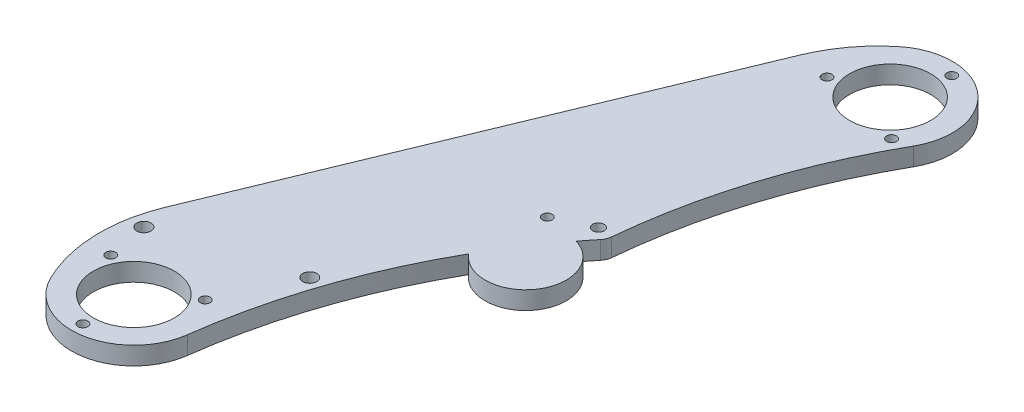
ISO-10303-21;
HEADER;
FILE_DESCRIPTION(('STEP AP214'),'2;1');
FILE_NAME('part.step','',(''),(''),'','','');
FILE_SCHEMA(('AUTOMOTIVE_DESIGN { 1 0 10303 214 1 1 1 1 }'));
ENDSEC;
DATA;
#1=APPLICATION_CONTEXT('core data for automotive mechanical design processes');
#2=APPLICATION_PROTOCOL_DEFINITION('international standard','automotive_design',2000,#1);
#3=PRODUCT_CONTEXT('',#1,'mechanical');
#4=PRODUCT('Part','Part','',(#3));
#5=PRODUCT_RELATED_PRODUCT_CATEGORY('part','',(#4));
#6=PRODUCT_DEFINITION_FORMATION('','',#4);
#7=PRODUCT_DEFINITION_CONTEXT('part definition',#1,'design');
#8=PRODUCT_DEFINITION('design','',#6,#7);
#9=PRODUCT_DEFINITION_SHAPE('','',#8);
#10=(LENGTH_UNIT() NAMED_UNIT(*) SI_UNIT(.MILLI.,.METRE.));
#11=(NAMED_UNIT(*) PLANE_ANGLE_UNIT() SI_UNIT($,.RADIAN.));
#12=(NAMED_UNIT(*) SI_UNIT($,.STERADIAN.) SOLID_ANGLE_UNIT());
#13=UNCERTAINTY_MEASURE_WITH_UNIT(LENGTH_MEASURE(1.E-05),#10,'distance_accuracy_value','');
#14=(GEOMETRIC_REPRESENTATION_CONTEXT(3) GLOBAL_UNCERTAINTY_ASSIGNED_CONTEXT((#13)) GLOBAL_UNIT_ASSIGNED_CONTEXT((#10,
#11,#12)) REPRESENTATION_CONTEXT('',''));
#15=CARTESIAN_POINT('',(0.,0.,0.));
#16=DIRECTION('',(0.,0.,1.));
#17=DIRECTION('',(1.,0.,0.));
#18=AXIS2_PLACEMENT_3D('',#15,#16,#17);
#19=CARTESIAN_POINT('',(-65.5552213636736,6.35,-46.4255332852399));
#20=DIRECTION('',(0.,-1.,0.));
#21=DIRECTION('',(0.,0.,-1.));
#22=AXIS2_PLACEMENT_3D('',#19,#20,#21);
#23=CYLINDRICAL_SURFACE('',#22,5.1943);
#24=CARTESIAN_POINT('',(-65.5552213636736,0.,-46.4255332852399));
#25=DIRECTION('',(0.,1.,0.));
#26=DIRECTION('',(0.,0.,1.));
#27=AXIS2_PLACEMENT_3D('',#24,#25,#26);
#28=CIRCLE('',#27,5.1943);
#29=CARTESIAN_POINT('',(-61.5228035545966,0.,-43.1513373376769));
#30=VERTEX_POINT('',#29);
#31=CARTESIAN_POINT('',(-60.3842207954488,0.,-45.93410107891));
#32=VERTEX_POINT('',#31);
#33=EDGE_CURVE('E155',#30,#32,#28,.T.);
#34=ORIENTED_EDGE('',*,*,#33,.T.);
#35=DIRECTION('',(0.,-1.,0.));
#36=VECTOR('',#35,1.);
#37=CARTESIAN_POINT('',(-60.3842207954488,6.35,-45.93410107891));
#38=LINE('',#37,#36);
#39=CARTESIAN_POINT('',(-60.3842207954488,6.35,-45.93410107891));
#40=VERTEX_POINT('',#39);
#41=EDGE_CURVE('E11',#40,#32,#38,.T.);
#42=ORIENTED_EDGE('',*,*,#41,.F.);
#43=CARTESIAN_POINT('',(-65.5552213636736,6.35,-46.4255332852399));
#44=DIRECTION('',(0.,1.,0.));
#45=DIRECTION('',(0.,0.,1.));
#46=AXIS2_PLACEMENT_3D('',#43,#44,#45);
#47=CIRCLE('',#46,5.1943);
#48=CARTESIAN_POINT('',(-61.5228035545966,6.35,-43.1513373376769));
#49=VERTEX_POINT('',#48);
#50=EDGE_CURVE('E232',#49,#40,#47,.T.);
#51=ORIENTED_EDGE('',*,*,#50,.F.);
#52=DIRECTION('',(0.,-1.,0.));
#53=VECTOR('',#52,1.);
#54=CARTESIAN_POINT('',(-61.5228035545966,6.35,-43.1513373376769));
#55=LINE('',#54,#53);
#56=EDGE_CURVE('E151',#49,#30,#55,.T.);
#57=ORIENTED_EDGE('',*,*,#56,.T.);
#58=EDGE_LOOP('',(#34,#42,#51,#57));
#59=FACE_BOUND('',#58,.T.);
#60=ADVANCED_FACE('F37',(#59),#23,.T.);
#61=CARTESIAN_POINT('',(141.904309990853,6.35,-26.7093692909436));
#62=DIRECTION('',(0.,-1.,0.));
#63=DIRECTION('',(0.,0.,-1.));
#64=AXIS2_PLACEMENT_3D('',#61,#62,#63);
#65=CYLINDRICAL_SURFACE('',#64,203.2);
#66=CARTESIAN_POINT('',(141.904309990853,0.,-26.7093692909436));
#67=DIRECTION('',(0.,1.,0.));
#68=DIRECTION('',(0.,0.,1.));
#69=AXIS2_PLACEMENT_3D('',#66,#67,#68);
#70=CIRCLE('',#69,203.2);
#71=CARTESIAN_POINT('',(-34.9119923986334,0.,-126.840459414389));
#72=VERTEX_POINT('',#71);
#73=EDGE_CURVE('E159',#32,#72,#70,.F.);
#74=ORIENTED_EDGE('',*,*,#73,.T.);
#75=DIRECTION('',(0.,-1.,0.));
#76=VECTOR('',#75,1.);
#77=CARTESIAN_POINT('',(-34.9119923986334,6.35,-126.840459414389));
#78=LINE('',#77,#76);
#79=CARTESIAN_POINT('',(-34.9119923986334,6.35,-126.840459414389));
#80=VERTEX_POINT('',#79);
#81=EDGE_CURVE('E46',#80,#72,#78,.T.);
#82=ORIENTED_EDGE('',*,*,#81,.F.);
#83=CARTESIAN_POINT('',(141.904309990853,6.35,-26.7093692909436));
#84=DIRECTION('',(0.,1.,0.));
#85=DIRECTION('',(0.,0.,1.));
#86=AXIS2_PLACEMENT_3D('',#83,#84,#85);
#87=CIRCLE('',#86,203.2);
#88=EDGE_CURVE('E103',#40,#80,#87,.F.);
#89=ORIENTED_EDGE('',*,*,#88,.F.);
#90=ORIENTED_EDGE('',*,*,#41,.T.);
#91=EDGE_LOOP('',(#74,#82,#89,#90));
#92=FACE_BOUND('',#91,.T.);
#93=ADVANCED_FACE('F248',(#92),#65,.F.);
#94=CARTESIAN_POINT('',(-53.975,6.35,-137.635842568323));
#95=DIRECTION('',(0.,-1.,0.));
#96=DIRECTION('',(0.,0.,-1.));
#97=AXIS2_PLACEMENT_3D('',#94,#95,#96);
#98=CYLINDRICAL_SURFACE('',#97,21.9075);
#99=CARTESIAN_POINT('',(-53.975,0.,-137.635842568323));
#100=DIRECTION('',(0.,1.,0.));
#101=DIRECTION('',(0.,0.,1.));
#102=AXIS2_PLACEMENT_3D('',#99,#100,#101);
#103=CIRCLE('',#102,21.9075);
#104=CARTESIAN_POINT('',(-67.7923420567548,0.,-154.636419462553));
#105=VERTEX_POINT('',#104);
#106=EDGE_CURVE('E161',#72,#105,#103,.T.);
#107=ORIENTED_EDGE('',*,*,#106,.T.);
#108=DIRECTION('',(0.,-1.,0.));
#109=VECTOR('',#108,1.);
#110=CARTESIAN_POINT('',(-67.7923420567548,6.35,-154.636419462553));
#111=LINE('',#110,#109);
#112=CARTESIAN_POINT('',(-67.7923420567548,6.35,-154.636419462553));
#113=VERTEX_POINT('',#112);
#114=EDGE_CURVE('E193',#113,#105,#111,.T.);
#115=ORIENTED_EDGE('',*,*,#114,.F.);
#116=CARTESIAN_POINT('',(-53.975,6.35,-137.635842568323));
#117=DIRECTION('',(0.,1.,0.));
#118=DIRECTION('',(0.,0.,1.));
#119=AXIS2_PLACEMENT_3D('',#116,#117,#118);
#120=CIRCLE('',#119,21.9075);
#121=EDGE_CURVE('E200',#80,#113,#120,.T.);
#122=ORIENTED_EDGE('',*,*,#121,.F.);
#123=ORIENTED_EDGE('',*,*,#81,.T.);
#124=EDGE_LOOP('',(#107,#115,#122,#123));
#125=FACE_BOUND('',#124,.T.);
#126=ADVANCED_FACE('F198',(#125),#98,.T.);
#127=CARTESIAN_POINT('',(-35.7521285918161,6.35,-115.214791881729));
#128=DIRECTION('',(0.,-1.,0.));
#129=DIRECTION('',(0.,0.,-1.));
#130=AXIS2_PLACEMENT_3D('',#127,#128,#129);
#131=CYLINDRICAL_SURFACE('',#130,50.8);
#132=CARTESIAN_POINT('',(-35.7521285918161,0.,-115.214791881729));
#133=DIRECTION('',(0.,1.,0.));
#134=DIRECTION('',(0.,0.,1.));
#135=AXIS2_PLACEMENT_3D('',#132,#133,#134);
#136=CIRCLE('',#135,50.8);
#137=CARTESIAN_POINT('',(-82.707652255193,0.,-134.600838345566));
#138=VERTEX_POINT('',#137);
#139=EDGE_CURVE('E164',#138,#105,#136,.F.);
#140=ORIENTED_EDGE('',*,*,#139,.F.);
#141=DIRECTION('',(0.,-1.,0.));
#142=VECTOR('',#141,1.);
#143=CARTESIAN_POINT('',(-82.707652255193,6.35,-134.600838345566));
#144=LINE('',#143,#142);
#145=CARTESIAN_POINT('',(-82.707652255193,6.35,-134.600838345566));
#146=VERTEX_POINT('',#145);
#147=EDGE_CURVE('E191',#146,#138,#144,.T.);
#148=ORIENTED_EDGE('',*,*,#147,.F.);
#149=CARTESIAN_POINT('',(-35.7521285918161,6.35,-115.214791881729));
#150=DIRECTION('',(0.,1.,0.));
#151=DIRECTION('',(0.,0.,1.));
#152=AXIS2_PLACEMENT_3D('',#149,#150,#151);
#153=CIRCLE('',#152,50.8);
#154=EDGE_CURVE('E213',#146,#113,#153,.F.);
#155=ORIENTED_EDGE('',*,*,#154,.T.);
#156=ORIENTED_EDGE('',*,*,#114,.T.);
#157=EDGE_LOOP('',(#140,#148,#155,#156));
#158=FACE_BOUND('',#157,.T.);
#159=ADVANCED_FACE('F209',(#158),#131,.T.);
#160=CARTESIAN_POINT('',(-118.141352809997,6.35,-48.7758111547056));
#161=DIRECTION('',(0.924321331956238,0.,0.38161508787081));
#162=DIRECTION('',(0.38161508787081,0.,-0.924321331956238));
#163=AXIS2_PLACEMENT_3D('',#160,#161,#162);
#164=PLANE('',#163);
#165=DIRECTION('',(-0.38161508787081,0.,0.924321331956238));
#166=VECTOR('',#165,1.);
#167=CARTESIAN_POINT('',(-118.141352809997,0.,-48.7758111547056));
#168=LINE('',#167,#166);
#169=CARTESIAN_POINT('',(-148.057506617308,0.,23.6850008337937));
#170=VERTEX_POINT('',#169);
#171=EDGE_CURVE('E167',#138,#170,#168,.T.);
#172=ORIENTED_EDGE('',*,*,#171,.T.);
#173=DIRECTION('',(0.,-1.,0.));
#174=VECTOR('',#173,1.);
#175=CARTESIAN_POINT('',(-148.057506617308,6.35,23.6850008337937));
#176=LINE('',#175,#174);
#177=CARTESIAN_POINT('',(-148.057506617308,6.35,23.6850008337937));
#178=VERTEX_POINT('',#177);
#179=EDGE_CURVE('E188',#178,#170,#176,.T.);
#180=ORIENTED_EDGE('',*,*,#179,.F.);
#181=DIRECTION('',(-0.38161508787081,0.,0.924321331956238));
#182=VECTOR('',#181,1.);
#183=CARTESIAN_POINT('',(-118.141352809997,6.35,-48.7758111547056));
#184=LINE('',#183,#182);
#185=EDGE_CURVE('E214',#146,#178,#184,.T.);
#186=ORIENTED_EDGE('',*,*,#185,.F.);
#187=ORIENTED_EDGE('',*,*,#147,.T.);
#188=EDGE_LOOP('',(#172,#180,#186,#187));
#189=FACE_BOUND('',#188,.T.);
#190=ADVANCED_FACE('F258',(#189),#164,.F.);
#191=CARTESIAN_POINT('',(-101.101982953931,6.35,43.0710472976309));
#192=DIRECTION('',(0.,-1.,0.));
#193=DIRECTION('',(0.,0.,-1.));
#194=AXIS2_PLACEMENT_3D('',#191,#192,#193);
#195=CYLINDRICAL_SURFACE('',#194,50.8);
#196=CARTESIAN_POINT('',(-101.101982953931,0.,43.0710472976309));
#197=DIRECTION('',(0.,1.,0.));
#198=DIRECTION('',(0.,0.,1.));
#199=AXIS2_PLACEMENT_3D('',#196,#197,#198);
#200=CIRCLE('',#199,50.8);
#201=CARTESIAN_POINT('',(-146.636957979986,0.,65.5922828182799));
#202=VERTEX_POINT('',#201);
#203=EDGE_CURVE('E169',#170,#202,#200,.T.);
#204=ORIENTED_EDGE('',*,*,#203,.T.);
#205=DIRECTION('',(0.,-1.,0.));
#206=VECTOR('',#205,1.);
#207=CARTESIAN_POINT('',(-146.636957979986,6.35,65.5922828182799));
#208=LINE('',#207,#206);
#209=CARTESIAN_POINT('',(-146.636957979986,6.35,65.5922828182799));
#210=VERTEX_POINT('',#209);
#211=EDGE_CURVE('E185',#210,#202,#208,.T.);
#212=ORIENTED_EDGE('',*,*,#211,.F.);
#213=CARTESIAN_POINT('',(-101.101982953931,6.35,43.0710472976309));
#214=DIRECTION('',(0.,1.,0.));
#215=DIRECTION('',(0.,0.,1.));
#216=AXIS2_PLACEMENT_3D('',#213,#214,#215);
#217=CIRCLE('',#216,50.8);
#218=EDGE_CURVE('E216',#178,#210,#217,.T.);
#219=ORIENTED_EDGE('',*,*,#218,.F.);
#220=ORIENTED_EDGE('',*,*,#179,.T.);
#221=EDGE_LOOP('',(#204,#212,#219,#220));
#222=FACE_BOUND('',#221,.T.);
#223=ADVANCED_FACE('F225',(#222),#195,.T.);
#224=CARTESIAN_POINT('',(-127.,6.35,55.88));
#225=DIRECTION('',(0.,-1.,0.));
#226=DIRECTION('',(0.,0.,-1.));
#227=AXIS2_PLACEMENT_3D('',#224,#225,#226);
#228=CYLINDRICAL_SURFACE('',#227,21.9075);
#229=CARTESIAN_POINT('',(-127.,0.,55.88));
#230=DIRECTION('',(0.,1.,0.));
#231=DIRECTION('',(0.,0.,1.));
#232=AXIS2_PLACEMENT_3D('',#229,#230,#231);
#233=CIRCLE('',#232,21.9075);
#234=CARTESIAN_POINT('',(-105.275744886366,0.,58.7075954462638));
#235=VERTEX_POINT('',#234);
#236=EDGE_CURVE('E171',#202,#235,#233,.T.);
#237=ORIENTED_EDGE('',*,*,#236,.T.);
#238=DIRECTION('',(0.,-1.,0.));
#239=VECTOR('',#238,1.);
#240=CARTESIAN_POINT('',(-105.275744886366,6.35,58.7075954462638));
#241=LINE('',#240,#239);
#242=CARTESIAN_POINT('',(-105.275744886366,6.35,58.7075954462638));
#243=VERTEX_POINT('',#242);
#244=EDGE_CURVE('E138',#243,#235,#241,.T.);
#245=ORIENTED_EDGE('',*,*,#244,.F.);
#246=CARTESIAN_POINT('',(-127.,6.35,55.88));
#247=DIRECTION('',(0.,1.,0.));
#248=DIRECTION('',(0.,0.,1.));
#249=AXIS2_PLACEMENT_3D('',#246,#247,#248);
#250=CIRCLE('',#249,21.9075);
#251=EDGE_CURVE('E129',#210,#243,#250,.T.);
#252=ORIENTED_EDGE('',*,*,#251,.F.);
#253=ORIENTED_EDGE('',*,*,#211,.T.);
#254=EDGE_LOOP('',(#237,#245,#252,#253));
#255=FACE_BOUND('',#254,.T.);
#256=ADVANCED_FACE('F228',(#255),#228,.T.);
#257=CARTESIAN_POINT('',(96.2245923995182,6.35,84.9345677014636));
#258=DIRECTION('',(0.,-1.,0.));
#259=DIRECTION('',(0.,0.,-1.));
#260=AXIS2_PLACEMENT_3D('',#257,#258,#259);
#261=CYLINDRICAL_SURFACE('',#260,203.2);
#262=CARTESIAN_POINT('',(96.2245923995182,0.,84.9345677014636));
#263=DIRECTION('',(0.,1.,0.));
#264=DIRECTION('',(0.,0.,1.));
#265=AXIS2_PLACEMENT_3D('',#262,#263,#264);
#266=CIRCLE('',#265,203.2);
#267=CARTESIAN_POINT('',(-80.4181224157308,0.,-15.5024339597697));
#268=VERTEX_POINT('',#267);
#269=EDGE_CURVE('E137',#235,#268,#266,.F.);
#270=ORIENTED_EDGE('',*,*,#269,.T.);
#271=DIRECTION('',(0.,-1.,0.));
#272=VECTOR('',#271,1.);
#273=CARTESIAN_POINT('',(-80.4181224157308,6.35,-15.5024339597697));
#274=LINE('',#273,#272);
#275=CARTESIAN_POINT('',(-80.4181224157308,6.35,-15.5024339597697));
#276=VERTEX_POINT('',#275);
#277=EDGE_CURVE('E134',#276,#268,#274,.T.);
#278=ORIENTED_EDGE('',*,*,#277,.F.);
#279=CARTESIAN_POINT('',(96.2245923995182,6.35,84.9345677014636));
#280=DIRECTION('',(0.,1.,0.));
#281=DIRECTION('',(0.,0.,1.));
#282=AXIS2_PLACEMENT_3D('',#279,#280,#281);
#283=CIRCLE('',#282,203.2);
#284=EDGE_CURVE('E122',#243,#276,#283,.F.);
#285=ORIENTED_EDGE('',*,*,#284,.F.);
#286=ORIENTED_EDGE('',*,*,#244,.T.);
#287=EDGE_LOOP('',(#270,#278,#285,#286));
#288=FACE_BOUND('',#287,.T.);
#289=ADVANCED_FACE('F135',(#288),#261,.F.);
#290=CARTESIAN_POINT('',(-69.4805741045261,6.35,-24.694968604255));
#291=DIRECTION('',(0.,-1.,0.));
#292=DIRECTION('',(0.,0.,-1.));
#293=AXIS2_PLACEMENT_3D('',#290,#291,#292);
#294=CYLINDRICAL_SURFACE('',#293,14.2875);
#295=CARTESIAN_POINT('',(-69.4805741045261,0.,-24.694968604255));
#296=DIRECTION('',(0.,1.,0.));
#297=DIRECTION('',(0.,0.,1.));
#298=AXIS2_PLACEMENT_3D('',#295,#296,#297);
#299=CIRCLE('',#298,14.2875);
#300=CARTESIAN_POINT('',(-65.2979827555747,0.,-38.3565419345006));
#301=VERTEX_POINT('',#300);
#302=EDGE_CURVE('E89',#268,#301,#299,.T.);
#303=ORIENTED_EDGE('',*,*,#302,.T.);
#304=DIRECTION('',(0.,-1.,0.));
#305=VECTOR('',#304,1.);
#306=CARTESIAN_POINT('',(-65.2979827555747,6.35,-38.3565419345006));
#307=LINE('',#306,#305);
#308=CARTESIAN_POINT('',(-65.2979827555747,6.35,-38.3565419345006));
#309=VERTEX_POINT('',#308);
#310=EDGE_CURVE('E139',#309,#301,#307,.T.);
#311=ORIENTED_EDGE('',*,*,#310,.F.);
#312=CARTESIAN_POINT('',(-69.4805741045261,6.35,-24.694968604255));
#313=DIRECTION('',(0.,1.,0.));
#314=DIRECTION('',(0.,0.,1.));
#315=AXIS2_PLACEMENT_3D('',#312,#313,#314);
#316=CIRCLE('',#315,14.2875);
#317=EDGE_CURVE('E127',#276,#309,#316,.T.);
#318=ORIENTED_EDGE('',*,*,#317,.F.);
#319=ORIENTED_EDGE('',*,*,#277,.T.);
#320=EDGE_LOOP('',(#303,#311,#318,#319));
#321=FACE_BOUND('',#320,.T.);
#322=ADVANCED_FACE('F141',(#321),#294,.T.);
#323=CARTESIAN_POINT('',(-53.975,6.35,-137.635842568323));
#324=DIRECTION('',(0.,-1.,0.));
#325=DIRECTION('',(0.,0.,-1.));
#326=AXIS2_PLACEMENT_3D('',#323,#324,#325);
#327=CYLINDRICAL_SURFACE('',#326,14.2875);
#328=CARTESIAN_POINT('',(-53.975,6.35,-137.635842568323));
#329=DIRECTION('',(0.,1.,0.));
#330=DIRECTION('',(0.,0.,1.));
#331=AXIS2_PLACEMENT_3D('',#328,#329,#330);
#332=CIRCLE('',#331,14.2875);
#333=CARTESIAN_POINT('',(-53.975,6.35,-123.348342568323));
#334=VERTEX_POINT('',#333);
#335=EDGE_CURVE('E143',#334,#334,#332,.T.);
#336=ORIENTED_EDGE('',*,*,#335,.T.);
#337=EDGE_LOOP('',(#336));
#338=FACE_BOUND('',#337,.T.);
#339=CARTESIAN_POINT('',(-53.975,0.,-137.635842568323));
#340=DIRECTION('',(0.,1.,0.));
#341=DIRECTION('',(0.,0.,1.));
#342=AXIS2_PLACEMENT_3D('',#339,#340,#341);
#343=CIRCLE('',#342,14.2875);
#344=CARTESIAN_POINT('',(-53.975,0.,-123.348342568323));
#345=VERTEX_POINT('',#344);
#346=EDGE_CURVE('E175',#345,#345,#343,.T.);
#347=ORIENTED_EDGE('',*,*,#346,.F.);
#348=EDGE_LOOP('',(#347));
#349=FACE_BOUND('',#348,.T.);
#350=ADVANCED_FACE('F235',(#338,#349),#327,.F.);
#351=EDGE_CURVE('E95',#301,#30,#266,.F.);
#352=ORIENTED_EDGE('',*,*,#351,.T.);
#353=ORIENTED_EDGE('',*,*,#56,.F.);
#354=EDGE_CURVE('E54',#309,#49,#283,.F.);
#355=ORIENTED_EDGE('',*,*,#354,.F.);
#356=ORIENTED_EDGE('',*,*,#310,.T.);
#357=EDGE_LOOP('',(#352,#353,#355,#356));
#358=FACE_BOUND('',#357,.T.);
#359=ADVANCED_FACE('F233',(#358),#261,.F.);
#360=CARTESIAN_POINT('',(-65.5552213636736,6.35,-46.4255332852399));
#361=DIRECTION('',(0.,-1.,0.));
#362=DIRECTION('',(0.,0.,-1.));
#363=AXIS2_PLACEMENT_3D('',#360,#361,#362);
#364=CYLINDRICAL_SURFACE('',#363,2.01930000000001);
#365=CARTESIAN_POINT('',(-65.5552213636736,6.35,-46.4255332852399));
#366=DIRECTION('',(0.,1.,0.));
#367=DIRECTION('',(0.,0.,1.));
#368=AXIS2_PLACEMENT_3D('',#365,#366,#367);
#369=CIRCLE('',#368,2.01930000000001);
#370=CARTESIAN_POINT('',(-65.5552213636736,6.35,-44.4062332852399));
#371=VERTEX_POINT('',#370);
#372=EDGE_CURVE('E181',#371,#371,#369,.T.);
#373=ORIENTED_EDGE('',*,*,#372,.T.);
#374=EDGE_LOOP('',(#373));
#375=FACE_BOUND('',#374,.T.);
#376=CARTESIAN_POINT('',(-65.5552213636736,0.,-46.4255332852399));
#377=DIRECTION('',(0.,1.,0.));
#378=DIRECTION('',(0.,0.,1.));
#379=AXIS2_PLACEMENT_3D('',#376,#377,#378);
#380=CIRCLE('',#379,2.01930000000001);
#381=CARTESIAN_POINT('',(-65.5552213636736,0.,-44.4062332852399));
#382=VERTEX_POINT('',#381);
#383=EDGE_CURVE('E152',#382,#382,#380,.T.);
#384=ORIENTED_EDGE('',*,*,#383,.F.);
#385=EDGE_LOOP('',(#384));
#386=FACE_BOUND('',#385,.T.);
#387=ADVANCED_FACE('F39',(#375,#386),#364,.F.);
#388=CARTESIAN_POINT('',(-127.,6.35,55.88));
#389=DIRECTION('',(0.,-1.,0.));
#390=DIRECTION('',(0.,0.,-1.));
#391=AXIS2_PLACEMENT_3D('',#388,#389,#390);
#392=CYLINDRICAL_SURFACE('',#391,14.2875);
#393=CARTESIAN_POINT('',(-127.,6.35,55.88));
#394=DIRECTION('',(0.,1.,0.));
#395=DIRECTION('',(0.,0.,1.));
#396=AXIS2_PLACEMENT_3D('',#393,#394,#395);
#397=CIRCLE('',#396,14.2875);
#398=CARTESIAN_POINT('',(-127.,6.35,70.1675));
#399=VERTEX_POINT('',#398);
#400=EDGE_CURVE('E148',#399,#399,#397,.T.);
#401=ORIENTED_EDGE('',*,*,#400,.T.);
#402=EDGE_LOOP('',(#401));
#403=FACE_BOUND('',#402,.T.);
#404=CARTESIAN_POINT('',(-127.,0.,55.88));
#405=DIRECTION('',(0.,1.,0.));
#406=DIRECTION('',(0.,0.,1.));
#407=AXIS2_PLACEMENT_3D('',#404,#405,#406);
#408=CIRCLE('',#407,14.2875);
#409=CARTESIAN_POINT('',(-127.,0.,70.1675));
#410=VERTEX_POINT('',#409);
#411=EDGE_CURVE('E178',#410,#410,#408,.T.);
#412=ORIENTED_EDGE('',*,*,#411,.F.);
#413=EDGE_LOOP('',(#412));
#414=FACE_BOUND('',#413,.T.);
#415=ADVANCED_FACE('F241',(#403,#414),#392,.F.);
#416=CARTESIAN_POINT('',(0.,6.35,0.));
#417=DIRECTION('',(0.,1.,0.));
#418=DIRECTION('',(0.,0.,1.));
#419=AXIS2_PLACEMENT_3D('',#416,#417,#418);
#420=PLANE('',#419);
#421=CARTESIAN_POINT('',(-101.174108344345,6.35,19.7023021712217));
#422=DIRECTION('',(0.,1.,0.));
#423=DIRECTION('',(0.,0.,1.));
#424=AXIS2_PLACEMENT_3D('',#421,#422,#423);
#425=CIRCLE('',#424,2.48920000000002);
#426=CARTESIAN_POINT('',(-101.174108344345,6.35,22.1915021712217));
#427=VERTEX_POINT('',#426);
#428=EDGE_CURVE('E412',#427,#427,#425,.T.);
#429=ORIENTED_EDGE('',*,*,#428,.F.);
#430=EDGE_LOOP('',(#429));
#431=FACE_BOUND('',#430,.T.);
#432=CARTESIAN_POINT('',(-145.814941347166,6.35,33.528));
#433=DIRECTION('',(0.,1.,0.));
#434=DIRECTION('',(0.,0.,1.));
#435=AXIS2_PLACEMENT_3D('',#432,#433,#434);
#436=CIRCLE('',#435,2.4892);
#437=CARTESIAN_POINT('',(-145.814941347166,6.35,36.0172));
#438=VERTEX_POINT('',#437);
#439=EDGE_CURVE('E416',#438,#438,#436,.T.);
#440=ORIENTED_EDGE('',*,*,#439,.F.);
#441=EDGE_LOOP('',(#440));
#442=FACE_BOUND('',#441,.T.);
#443=CARTESIAN_POINT('',(-143.092825696254,6.35,47.9397496815287));
#444=DIRECTION('',(0.,1.,0.));
#445=DIRECTION('',(0.,0.,1.));
#446=AXIS2_PLACEMENT_3D('',#443,#444,#445);
#447=CIRCLE('',#446,1.7272);
#448=CARTESIAN_POINT('',(-143.092825696254,6.35,49.6669496815287));
#449=VERTEX_POINT('',#448);
#450=EDGE_CURVE('E428',#449,#449,#447,.T.);
#451=ORIENTED_EDGE('',*,*,#450,.F.);
#452=EDGE_LOOP('',(#451));
#453=FACE_BOUND('',#452,.T.);
#454=CARTESIAN_POINT('',(-49.6872948390665,6.35,-155.061174658785));
#455=DIRECTION('',(0.,1.,0.));
#456=DIRECTION('',(0.,0.,1.));
#457=AXIS2_PLACEMENT_3D('',#454,#455,#456);
#458=CIRCLE('',#457,1.7272);
#459=CARTESIAN_POINT('',(-49.6872948390665,6.35,-153.333974658785));
#460=VERTEX_POINT('',#459);
#461=EDGE_CURVE('E425',#460,#460,#458,.T.);
#462=ORIENTED_EDGE('',*,*,#461,.F.);
#463=EDGE_LOOP('',(#462));
#464=FACE_BOUND('',#463,.T.);
#465=CARTESIAN_POINT('',(-71.2096328401876,6.35,-132.636438116398));
#466=DIRECTION('',(0.,1.,0.));
#467=DIRECTION('',(0.,0.,1.));
#468=AXIS2_PLACEMENT_3D('',#465,#466,#467);
#469=CIRCLE('',#468,1.72720000000001);
#470=CARTESIAN_POINT('',(-71.2096328401876,6.35,-130.909238116398));
#471=VERTEX_POINT('',#470);
#472=EDGE_CURVE('E442',#471,#471,#469,.T.);
#473=ORIENTED_EDGE('',*,*,#472,.F.);
#474=EDGE_LOOP('',(#473));
#475=FACE_BOUND('',#474,.T.);
#476=CARTESIAN_POINT('',(-77.7927695255543,6.35,-40.5988681667095));
#477=DIRECTION('',(0.,1.,0.));
#478=DIRECTION('',(0.,0.,1.));
#479=AXIS2_PLACEMENT_3D('',#476,#477,#478);
#480=CIRCLE('',#479,1.7272);
#481=CARTESIAN_POINT('',(-77.7927695255543,6.35,-38.8716681667095));
#482=VERTEX_POINT('',#481);
#483=EDGE_CURVE('E436',#482,#482,#480,.T.);
#484=ORIENTED_EDGE('',*,*,#483,.F.);
#485=EDGE_LOOP('',(#484));
#486=FACE_BOUND('',#485,.T.);
#487=CARTESIAN_POINT('',(-41.028072320746,6.35,-125.209914929785));
#488=DIRECTION('',(0.,1.,0.));
#489=DIRECTION('',(0.,0.,1.));
#490=AXIS2_PLACEMENT_3D('',#487,#488,#489);
#491=CIRCLE('',#490,1.72720000000001);
#492=CARTESIAN_POINT('',(-41.028072320746,6.35,-123.482714929785));
#493=VERTEX_POINT('',#492);
#494=EDGE_CURVE('E435',#493,#493,#491,.T.);
#495=ORIENTED_EDGE('',*,*,#494,.F.);
#496=EDGE_LOOP('',(#495));
#497=FACE_BOUND('',#496,.T.);
#498=CARTESIAN_POINT('',(-127.,6.35,73.8251));
#499=DIRECTION('',(0.,1.,0.));
#500=DIRECTION('',(0.,0.,1.));
#501=AXIS2_PLACEMENT_3D('',#498,#499,#500);
#502=CIRCLE('',#501,1.7272);
#503=CARTESIAN_POINT('',(-127.,6.35,75.5523));
#504=VERTEX_POINT('',#503);
#505=EDGE_CURVE('E458',#504,#504,#502,.T.);
#506=ORIENTED_EDGE('',*,*,#505,.F.);
#507=EDGE_LOOP('',(#506));
#508=FACE_BOUND('',#507,.T.);
#509=CARTESIAN_POINT('',(-112.75866789711,6.35,44.9616176131629));
#510=DIRECTION('',(0.,1.,0.));
#511=DIRECTION('',(0.,0.,1.));
#512=AXIS2_PLACEMENT_3D('',#509,#510,#511);
#513=CIRCLE('',#512,1.7272);
#514=CARTESIAN_POINT('',(-112.75866789711,6.35,46.6888176131629));
#515=VERTEX_POINT('',#514);
#516=EDGE_CURVE('E452',#515,#515,#513,.T.);
#517=ORIENTED_EDGE('',*,*,#516,.F.);
#518=EDGE_LOOP('',(#517));
#519=FACE_BOUND('',#518,.T.);
#520=ORIENTED_EDGE('',*,*,#372,.F.);
#521=EDGE_LOOP('',(#520));
#522=FACE_BOUND('',#521,.T.);
#523=ORIENTED_EDGE('',*,*,#50,.T.);
#524=ORIENTED_EDGE('',*,*,#88,.T.);
#525=ORIENTED_EDGE('',*,*,#121,.T.);
#526=ORIENTED_EDGE('',*,*,#154,.F.);
#527=ORIENTED_EDGE('',*,*,#185,.T.);
#528=ORIENTED_EDGE('',*,*,#218,.T.);
#529=ORIENTED_EDGE('',*,*,#251,.T.);
#530=ORIENTED_EDGE('',*,*,#284,.T.);
#531=ORIENTED_EDGE('',*,*,#317,.T.);
#532=ORIENTED_EDGE('',*,*,#354,.T.);
#533=EDGE_LOOP('',(#523,#524,#525,#526,#527,#528,#529,#530,#531,#532));
#534=FACE_BOUND('',#533,.T.);
#535=ORIENTED_EDGE('',*,*,#335,.F.);
#536=EDGE_LOOP('',(#535));
#537=FACE_BOUND('',#536,.T.);
#538=ORIENTED_EDGE('',*,*,#400,.F.);
#539=EDGE_LOOP('',(#538));
#540=FACE_BOUND('',#539,.T.);
#541=ADVANCED_FACE('F124',(#431,#442,#453,#464,#475,#486,#497,#508,#519,#522,#534,#537,#540),
#420,.T.);
#542=CARTESIAN_POINT('',(0.,0.,0.));
#543=DIRECTION('',(0.,1.,0.));
#544=DIRECTION('',(0.,0.,1.));
#545=AXIS2_PLACEMENT_3D('',#542,#543,#544);
#546=PLANE('',#545);
#547=CARTESIAN_POINT('',(-101.174108344345,0.,19.7023021712217));
#548=DIRECTION('',(0.,1.,0.));
#549=DIRECTION('',(0.,0.,1.));
#550=AXIS2_PLACEMENT_3D('',#547,#548,#549);
#551=CIRCLE('',#550,2.48920000000002);
#552=CARTESIAN_POINT('',(-101.174108344345,0.,22.1915021712217));
#553=VERTEX_POINT('',#552);
#554=EDGE_CURVE('E415',#553,#553,#551,.T.);
#555=ORIENTED_EDGE('',*,*,#554,.T.);
#556=EDGE_LOOP('',(#555));
#557=FACE_BOUND('',#556,.T.);
#558=CARTESIAN_POINT('',(-145.814941347166,0.,33.528));
#559=DIRECTION('',(0.,1.,0.));
#560=DIRECTION('',(0.,0.,1.));
#561=AXIS2_PLACEMENT_3D('',#558,#559,#560);
#562=CIRCLE('',#561,2.4892);
#563=CARTESIAN_POINT('',(-145.814941347166,0.,36.0172));
#564=VERTEX_POINT('',#563);
#565=EDGE_CURVE('E417',#564,#564,#562,.T.);
#566=ORIENTED_EDGE('',*,*,#565,.T.);
#567=EDGE_LOOP('',(#566));
#568=FACE_BOUND('',#567,.T.);
#569=CARTESIAN_POINT('',(-143.092825696254,0.,47.9397496815287));
#570=DIRECTION('',(0.,1.,0.));
#571=DIRECTION('',(0.,0.,1.));
#572=AXIS2_PLACEMENT_3D('',#569,#570,#571);
#573=CIRCLE('',#572,1.7272);
#574=CARTESIAN_POINT('',(-143.092825696254,0.,49.6669496815287));
#575=VERTEX_POINT('',#574);
#576=EDGE_CURVE('E156',#575,#575,#573,.T.);
#577=ORIENTED_EDGE('',*,*,#576,.T.);
#578=EDGE_LOOP('',(#577));
#579=FACE_BOUND('',#578,.T.);
#580=CARTESIAN_POINT('',(-49.6872948390665,0.,-155.061174658785));
#581=DIRECTION('',(0.,1.,0.));
#582=DIRECTION('',(0.,0.,1.));
#583=AXIS2_PLACEMENT_3D('',#580,#581,#582);
#584=CIRCLE('',#583,1.7272);
#585=CARTESIAN_POINT('',(-49.6872948390665,0.,-153.333974658785));
#586=VERTEX_POINT('',#585);
#587=EDGE_CURVE('E445',#586,#586,#584,.T.);
#588=ORIENTED_EDGE('',*,*,#587,.T.);
#589=EDGE_LOOP('',(#588));
#590=FACE_BOUND('',#589,.T.);
#591=CARTESIAN_POINT('',(-71.2096328401876,0.,-132.636438116398));
#592=DIRECTION('',(0.,1.,0.));
#593=DIRECTION('',(0.,0.,1.));
#594=AXIS2_PLACEMENT_3D('',#591,#592,#593);
#595=CIRCLE('',#594,1.72720000000001);
#596=CARTESIAN_POINT('',(-71.2096328401876,0.,-130.909238116398));
#597=VERTEX_POINT('',#596);
#598=EDGE_CURVE('E439',#597,#597,#595,.T.);
#599=ORIENTED_EDGE('',*,*,#598,.T.);
#600=EDGE_LOOP('',(#599));
#601=FACE_BOUND('',#600,.T.);
#602=CARTESIAN_POINT('',(-77.7927695255543,0.,-40.5988681667095));
#603=DIRECTION('',(0.,1.,0.));
#604=DIRECTION('',(0.,0.,1.));
#605=AXIS2_PLACEMENT_3D('',#602,#603,#604);
#606=CIRCLE('',#605,1.7272);
#607=CARTESIAN_POINT('',(-77.7927695255543,0.,-38.8716681667095));
#608=VERTEX_POINT('',#607);
#609=EDGE_CURVE('E432',#608,#608,#606,.T.);
#610=ORIENTED_EDGE('',*,*,#609,.T.);
#611=EDGE_LOOP('',(#610));
#612=FACE_BOUND('',#611,.T.);
#613=CARTESIAN_POINT('',(-41.028072320746,0.,-125.209914929785));
#614=DIRECTION('',(0.,1.,0.));
#615=DIRECTION('',(0.,0.,1.));
#616=AXIS2_PLACEMENT_3D('',#613,#614,#615);
#617=CIRCLE('',#616,1.72720000000001);
#618=CARTESIAN_POINT('',(-41.028072320746,0.,-123.482714929785));
#619=VERTEX_POINT('',#618);
#620=EDGE_CURVE('E461',#619,#619,#617,.T.);
#621=ORIENTED_EDGE('',*,*,#620,.T.);
#622=EDGE_LOOP('',(#621));
#623=FACE_BOUND('',#622,.T.);
#624=CARTESIAN_POINT('',(-127.,0.,73.8251));
#625=DIRECTION('',(0.,1.,0.));
#626=DIRECTION('',(0.,0.,1.));
#627=AXIS2_PLACEMENT_3D('',#624,#625,#626);
#628=CIRCLE('',#627,1.7272);
#629=CARTESIAN_POINT('',(-127.,0.,75.5523));
#630=VERTEX_POINT('',#629);
#631=EDGE_CURVE('E455',#630,#630,#628,.T.);
#632=ORIENTED_EDGE('',*,*,#631,.T.);
#633=EDGE_LOOP('',(#632));
#634=FACE_BOUND('',#633,.T.);
#635=CARTESIAN_POINT('',(-112.75866789711,0.,44.9616176131629));
#636=DIRECTION('',(0.,1.,0.));
#637=DIRECTION('',(0.,0.,1.));
#638=AXIS2_PLACEMENT_3D('',#635,#636,#637);
#639=CIRCLE('',#638,1.7272);
#640=CARTESIAN_POINT('',(-112.75866789711,0.,46.6888176131629));
#641=VERTEX_POINT('',#640);
#642=EDGE_CURVE('E431',#641,#641,#639,.T.);
#643=ORIENTED_EDGE('',*,*,#642,.T.);
#644=EDGE_LOOP('',(#643));
#645=FACE_BOUND('',#644,.T.);
#646=ORIENTED_EDGE('',*,*,#383,.T.);
#647=EDGE_LOOP('',(#646));
#648=FACE_BOUND('',#647,.T.);
#649=ORIENTED_EDGE('',*,*,#33,.F.);
#650=ORIENTED_EDGE('',*,*,#351,.F.);
#651=ORIENTED_EDGE('',*,*,#302,.F.);
#652=ORIENTED_EDGE('',*,*,#269,.F.);
#653=ORIENTED_EDGE('',*,*,#236,.F.);
#654=ORIENTED_EDGE('',*,*,#203,.F.);
#655=ORIENTED_EDGE('',*,*,#171,.F.);
#656=ORIENTED_EDGE('',*,*,#139,.T.);
#657=ORIENTED_EDGE('',*,*,#106,.F.);
#658=ORIENTED_EDGE('',*,*,#73,.F.);
#659=EDGE_LOOP('',(#649,#650,#651,#652,#653,#654,#655,#656,#657,#658));
#660=FACE_BOUND('',#659,.T.);
#661=ORIENTED_EDGE('',*,*,#346,.T.);
#662=EDGE_LOOP('',(#661));
#663=FACE_BOUND('',#662,.T.);
#664=ORIENTED_EDGE('',*,*,#411,.T.);
#665=EDGE_LOOP('',(#664));
#666=FACE_BOUND('',#665,.T.);
#667=ADVANCED_FACE('F203',(#557,#568,#579,#590,#601,#612,#623,#634,#645,#648,#660,#663,#666),
#546,.F.);
#668=CARTESIAN_POINT('',(-112.75866789711,0.,44.9616176131629));
#669=DIRECTION('',(0.,1.,0.));
#670=DIRECTION('',(0.,0.,1.));
#671=AXIS2_PLACEMENT_3D('',#668,#669,#670);
#672=CYLINDRICAL_SURFACE('',#671,1.7272);
#673=ORIENTED_EDGE('',*,*,#642,.F.);
#674=EDGE_LOOP('',(#673));
#675=FACE_BOUND('',#674,.T.);
#676=ORIENTED_EDGE('',*,*,#516,.T.);
#677=EDGE_LOOP('',(#676));
#678=FACE_BOUND('',#677,.T.);
#679=ADVANCED_FACE('F300',(#675,#678),#672,.F.);
#680=CARTESIAN_POINT('',(-127.,0.,73.8251));
#681=DIRECTION('',(0.,1.,0.));
#682=DIRECTION('',(0.,0.,1.));
#683=AXIS2_PLACEMENT_3D('',#680,#681,#682);
#684=CYLINDRICAL_SURFACE('',#683,1.7272);
#685=ORIENTED_EDGE('',*,*,#631,.F.);
#686=EDGE_LOOP('',(#685));
#687=FACE_BOUND('',#686,.T.);
#688=ORIENTED_EDGE('',*,*,#505,.T.);
#689=EDGE_LOOP('',(#688));
#690=FACE_BOUND('',#689,.T.);
#691=ADVANCED_FACE('F305',(#687,#690),#684,.F.);
#692=CARTESIAN_POINT('',(-41.028072320746,0.,-125.209914929785));
#693=DIRECTION('',(0.,1.,0.));
#694=DIRECTION('',(0.,0.,1.));
#695=AXIS2_PLACEMENT_3D('',#692,#693,#694);
#696=CYLINDRICAL_SURFACE('',#695,1.72720000000001);
#697=ORIENTED_EDGE('',*,*,#620,.F.);
#698=EDGE_LOOP('',(#697));
#699=FACE_BOUND('',#698,.T.);
#700=ORIENTED_EDGE('',*,*,#494,.T.);
#701=EDGE_LOOP('',(#700));
#702=FACE_BOUND('',#701,.T.);
#703=ADVANCED_FACE('F317',(#699,#702),#696,.F.);
#704=CARTESIAN_POINT('',(-77.7927695255543,0.,-40.5988681667095));
#705=DIRECTION('',(0.,1.,0.));
#706=DIRECTION('',(0.,0.,1.));
#707=AXIS2_PLACEMENT_3D('',#704,#705,#706);
#708=CYLINDRICAL_SURFACE('',#707,1.7272);
#709=ORIENTED_EDGE('',*,*,#609,.F.);
#710=EDGE_LOOP('',(#709));
#711=FACE_BOUND('',#710,.T.);
#712=ORIENTED_EDGE('',*,*,#483,.T.);
#713=EDGE_LOOP('',(#712));
#714=FACE_BOUND('',#713,.T.);
#715=ADVANCED_FACE('F327',(#711,#714),#708,.F.);
#716=CARTESIAN_POINT('',(-71.2096328401876,0.,-132.636438116398));
#717=DIRECTION('',(0.,1.,0.));
#718=DIRECTION('',(0.,0.,1.));
#719=AXIS2_PLACEMENT_3D('',#716,#717,#718);
#720=CYLINDRICAL_SURFACE('',#719,1.72720000000001);
#721=ORIENTED_EDGE('',*,*,#598,.F.);
#722=EDGE_LOOP('',(#721));
#723=FACE_BOUND('',#722,.T.);
#724=ORIENTED_EDGE('',*,*,#472,.T.);
#725=EDGE_LOOP('',(#724));
#726=FACE_BOUND('',#725,.T.);
#727=ADVANCED_FACE('F337',(#723,#726),#720,.F.);
#728=CARTESIAN_POINT('',(-49.6872948390665,0.,-155.061174658785));
#729=DIRECTION('',(0.,1.,0.));
#730=DIRECTION('',(0.,0.,1.));
#731=AXIS2_PLACEMENT_3D('',#728,#729,#730);
#732=CYLINDRICAL_SURFACE('',#731,1.7272);
#733=ORIENTED_EDGE('',*,*,#587,.F.);
#734=EDGE_LOOP('',(#733));
#735=FACE_BOUND('',#734,.T.);
#736=ORIENTED_EDGE('',*,*,#461,.T.);
#737=EDGE_LOOP('',(#736));
#738=FACE_BOUND('',#737,.T.);
#739=ADVANCED_FACE('F347',(#735,#738),#732,.F.);
#740=CARTESIAN_POINT('',(-143.092825696254,0.,47.9397496815287));
#741=DIRECTION('',(0.,1.,0.));
#742=DIRECTION('',(0.,0.,1.));
#743=AXIS2_PLACEMENT_3D('',#740,#741,#742);
#744=CYLINDRICAL_SURFACE('',#743,1.7272);
#745=ORIENTED_EDGE('',*,*,#576,.F.);
#746=EDGE_LOOP('',(#745));
#747=FACE_BOUND('',#746,.T.);
#748=ORIENTED_EDGE('',*,*,#450,.T.);
#749=EDGE_LOOP('',(#748));
#750=FACE_BOUND('',#749,.T.);
#751=ADVANCED_FACE('F357',(#747,#750),#744,.F.);
#752=CARTESIAN_POINT('',(-145.814941347166,0.,33.528));
#753=DIRECTION('',(0.,1.,0.));
#754=DIRECTION('',(0.,0.,1.));
#755=AXIS2_PLACEMENT_3D('',#752,#753,#754);
#756=CYLINDRICAL_SURFACE('',#755,2.4892);
#757=ORIENTED_EDGE('',*,*,#439,.T.);
#758=EDGE_LOOP('',(#757));
#759=FACE_BOUND('',#758,.T.);
#760=ORIENTED_EDGE('',*,*,#565,.F.);
#761=EDGE_LOOP('',(#760));
#762=FACE_BOUND('',#761,.T.);
#763=ADVANCED_FACE('F367',(#759,#762),#756,.F.);
#764=CARTESIAN_POINT('',(-101.174108344345,0.,19.7023021712217));
#765=DIRECTION('',(0.,1.,0.));
#766=DIRECTION('',(0.,0.,1.));
#767=AXIS2_PLACEMENT_3D('',#764,#765,#766);
#768=CYLINDRICAL_SURFACE('',#767,2.48920000000002);
#769=ORIENTED_EDGE('',*,*,#428,.T.);
#770=EDGE_LOOP('',(#769));
#771=FACE_BOUND('',#770,.T.);
#772=ORIENTED_EDGE('',*,*,#554,.F.);
#773=EDGE_LOOP('',(#772));
#774=FACE_BOUND('',#773,.T.);
#775=ADVANCED_FACE('F395',(#771,#774),#768,.F.);
#776=CLOSED_SHELL('',(#60,#93,#126,#159,#190,#223,#256,#289,#322,#350,#359,#387,#415,#541,#667,
#679,#691,#703,#715,#727,#739,#751,#763,#775));
#777=MANIFOLD_SOLID_BREP('B2',#776);
#778=ADVANCED_BREP_SHAPE_REPRESENTATION('',(#18,#777),#14);
#779=SHAPE_DEFINITION_REPRESENTATION(#9,#778);
ENDSEC;
END-ISO-10303-21;
